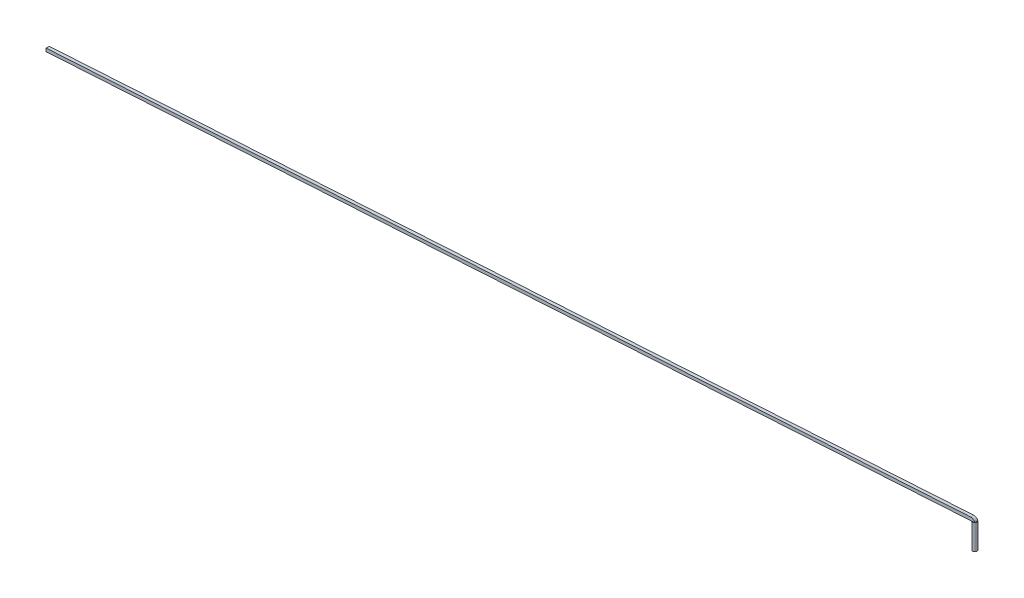
ISO-10303-21;
HEADER;
FILE_DESCRIPTION(('STEP AP214'),'2;1');
FILE_NAME('part.step','',(''),(''),'','','');
FILE_SCHEMA(('AUTOMOTIVE_DESIGN { 1 0 10303 214 1 1 1 1 }'));
ENDSEC;
DATA;
#1=APPLICATION_CONTEXT('core data for automotive mechanical design processes');
#2=APPLICATION_PROTOCOL_DEFINITION('international standard','automotive_design',2000,#1);
#3=PRODUCT_CONTEXT('',#1,'mechanical');
#4=PRODUCT('Part','Part','',(#3));
#5=PRODUCT_RELATED_PRODUCT_CATEGORY('part','',(#4));
#6=PRODUCT_DEFINITION_FORMATION('','',#4);
#7=PRODUCT_DEFINITION_CONTEXT('part definition',#1,'design');
#8=PRODUCT_DEFINITION('design','',#6,#7);
#9=PRODUCT_DEFINITION_SHAPE('','',#8);
#10=(LENGTH_UNIT() NAMED_UNIT(*) SI_UNIT(.MILLI.,.METRE.));
#11=(NAMED_UNIT(*) PLANE_ANGLE_UNIT() SI_UNIT($,.RADIAN.));
#12=(NAMED_UNIT(*) SI_UNIT($,.STERADIAN.) SOLID_ANGLE_UNIT());
#13=UNCERTAINTY_MEASURE_WITH_UNIT(LENGTH_MEASURE(1.E-05),#10,'distance_accuracy_value','');
#14=(GEOMETRIC_REPRESENTATION_CONTEXT(3) GLOBAL_UNCERTAINTY_ASSIGNED_CONTEXT((#13)) GLOBAL_UNIT_ASSIGNED_CONTEXT((#10,
#11,#12)) REPRESENTATION_CONTEXT('',''));
#15=CARTESIAN_POINT('',(0.,0.,0.));
#16=DIRECTION('',(0.,0.,1.));
#17=DIRECTION('',(1.,0.,0.));
#18=AXIS2_PLACEMENT_3D('',#15,#16,#17);
#19=CARTESIAN_POINT('',(-0.3,7.68120178719591,1.));
#20=DIRECTION('',(0.,0.,-1.));
#21=DIRECTION('',(-1.,0.,0.));
#22=AXIS2_PLACEMENT_3D('',#19,#20,#21);
#23=CYLINDRICAL_SURFACE('',#22,1.3);
#24=DIRECTION('',(0.,0.,-1.));
#25=VECTOR('',#24,1.);
#26=CARTESIAN_POINT('',(0.944368205131599,8.05743013548662,1.));
#27=LINE('',#26,#25);
#28=CARTESIAN_POINT('',(0.944368205131599,8.05743013548662,0.));
#29=VERTEX_POINT('',#28);
#30=CARTESIAN_POINT('',(0.944368205131599,8.05743013548662,1.));
#31=VERTEX_POINT('',#30);
#32=EDGE_CURVE('E104',#29,#31,#27,.F.);
#33=ORIENTED_EDGE('',*,*,#32,.F.);
#34=CARTESIAN_POINT('',(-0.3,7.68120178719591,0.));
#35=DIRECTION('',(0.,0.,1.));
#36=DIRECTION('',(1.,0.,0.));
#37=AXIS2_PLACEMENT_3D('',#34,#35,#36);
#38=CIRCLE('',#37,1.3);
#39=CARTESIAN_POINT('',(-0.378911491407106,8.97880456791268,0.));
#40=VERTEX_POINT('',#39);
#41=EDGE_CURVE('E89',#29,#40,#38,.T.);
#42=ORIENTED_EDGE('',*,*,#41,.T.);
#43=DIRECTION('',(0.,0.,-1.));
#44=VECTOR('',#43,1.);
#45=CARTESIAN_POINT('',(-0.378911491407106,8.97880456791268,1.));
#46=LINE('',#45,#44);
#47=CARTESIAN_POINT('',(-0.378911491407106,8.97880456791268,1.));
#48=VERTEX_POINT('',#47);
#49=EDGE_CURVE('E119',#48,#40,#46,.T.);
#50=ORIENTED_EDGE('',*,*,#49,.F.);
#51=CARTESIAN_POINT('',(-0.3,7.68120178719591,1.));
#52=DIRECTION('',(0.,0.,1.));
#53=DIRECTION('',(1.,0.,0.));
#54=AXIS2_PLACEMENT_3D('',#51,#52,#53);
#55=CIRCLE('',#54,1.3);
#56=EDGE_CURVE('E105',#31,#48,#55,.T.);
#57=ORIENTED_EDGE('',*,*,#56,.F.);
#58=EDGE_LOOP('',(#33,#42,#50,#57));
#59=FACE_BOUND('',#58,.T.);
#60=ADVANCED_FACE('F33',(#59),#23,.T.);
#61=CARTESIAN_POINT('',(-0.378911491407106,8.97880456791268,1.));
#62=DIRECTION('',(0.0607011472362354,-0.99815598516675,0.));
#63=DIRECTION('',(0.99815598516675,0.0607011472362354,0.));
#64=AXIS2_PLACEMENT_3D('',#61,#62,#63);
#65=PLANE('',#64);
#66=DIRECTION('',(-0.99815598516675,-0.0607011472362354,0.));
#67=VECTOR('',#66,1.);
#68=CARTESIAN_POINT('',(-0.378911491407106,8.97880456791268,0.));
#69=LINE('',#68,#67);
#70=CARTESIAN_POINT('',(-296.918177820015,-9.05472319150956,0.));
#71=VERTEX_POINT('',#70);
#72=EDGE_CURVE('E96',#40,#71,#69,.T.);
#73=ORIENTED_EDGE('',*,*,#72,.T.);
#74=DIRECTION('',(0.,0.,-1.));
#75=VECTOR('',#74,1.);
#76=CARTESIAN_POINT('',(-296.918177820015,-9.05472319150956,1.));
#77=LINE('',#76,#75);
#78=CARTESIAN_POINT('',(-296.918177820015,-9.05472319150956,1.));
#79=VERTEX_POINT('',#78);
#80=EDGE_CURVE('E112',#79,#71,#77,.T.);
#81=ORIENTED_EDGE('',*,*,#80,.F.);
#82=DIRECTION('',(-0.99815598516675,-0.0607011472362354,0.));
#83=VECTOR('',#82,1.);
#84=CARTESIAN_POINT('',(-0.378911491407106,8.97880456791268,1.));
#85=LINE('',#84,#83);
#86=EDGE_CURVE('E100',#48,#79,#85,.T.);
#87=ORIENTED_EDGE('',*,*,#86,.F.);
#88=ORIENTED_EDGE('',*,*,#49,.T.);
#89=EDGE_LOOP('',(#73,#81,#87,#88));
#90=FACE_BOUND('',#89,.T.);
#91=ADVANCED_FACE('F35',(#90),#65,.F.);
#92=CARTESIAN_POINT('',(-296.857476672778,-10.0528791766763,1.));
#93=DIRECTION('',(-0.998155985166741,-0.0607011472363859,0.));
#94=DIRECTION('',(0.0607011472363859,-0.998155985166741,0.));
#95=AXIS2_PLACEMENT_3D('',#92,#93,#94);
#96=PLANE('',#95);
#97=DIRECTION('',(-0.0607011472363859,0.998155985166741,0.));
#98=VECTOR('',#97,1.);
#99=CARTESIAN_POINT('',(-296.857476672778,-10.0528791766763,0.));
#100=LINE('',#99,#98);
#101=CARTESIAN_POINT('',(-296.857476672778,-10.0528791766763,0.));
#102=VERTEX_POINT('',#101);
#103=EDGE_CURVE('E126',#102,#71,#100,.T.);
#104=ORIENTED_EDGE('',*,*,#103,.F.);
#105=DIRECTION('',(0.,0.,-1.));
#106=VECTOR('',#105,1.);
#107=CARTESIAN_POINT('',(-296.857476672778,-10.0528791766763,1.));
#108=LINE('',#107,#106);
#109=CARTESIAN_POINT('',(-296.857476672778,-10.0528791766763,1.));
#110=VERTEX_POINT('',#109);
#111=EDGE_CURVE('E113',#110,#102,#108,.T.);
#112=ORIENTED_EDGE('',*,*,#111,.F.);
#113=DIRECTION('',(-0.0607011472363859,0.998155985166741,0.));
#114=VECTOR('',#113,1.);
#115=CARTESIAN_POINT('',(-296.857476672778,-10.0528791766763,1.));
#116=LINE('',#115,#114);
#117=EDGE_CURVE('E136',#110,#79,#116,.T.);
#118=ORIENTED_EDGE('',*,*,#117,.T.);
#119=ORIENTED_EDGE('',*,*,#80,.T.);
#120=EDGE_LOOP('',(#104,#112,#118,#119));
#121=FACE_BOUND('',#120,.T.);
#122=ADVANCED_FACE('F184',(#121),#96,.T.);
#123=CARTESIAN_POINT('',(-0.318210344170871,7.98064858274593,1.));
#124=DIRECTION('',(0.0607011472362354,-0.99815598516675,0.));
#125=DIRECTION('',(0.99815598516675,0.0607011472362354,0.));
#126=AXIS2_PLACEMENT_3D('',#123,#124,#125);
#127=PLANE('',#126);
#128=DIRECTION('',(-0.99815598516675,-0.0607011472362354,0.));
#129=VECTOR('',#128,1.);
#130=CARTESIAN_POINT('',(-0.318210344170871,7.98064858274593,0.));
#131=LINE('',#130,#129);
#132=CARTESIAN_POINT('',(-0.318210344170871,7.98064858274593,0.));
#133=VERTEX_POINT('',#132);
#134=EDGE_CURVE('E123',#133,#102,#131,.T.);
#135=ORIENTED_EDGE('',*,*,#134,.F.);
#136=DIRECTION('',(0.,0.,-1.));
#137=VECTOR('',#136,1.);
#138=CARTESIAN_POINT('',(-0.318210344170871,7.98064858274593,1.));
#139=LINE('',#138,#137);
#140=CARTESIAN_POINT('',(-0.318210344170871,7.98064858274593,1.));
#141=VERTEX_POINT('',#140);
#142=EDGE_CURVE('E117',#141,#133,#139,.T.);
#143=ORIENTED_EDGE('',*,*,#142,.F.);
#144=DIRECTION('',(-0.99815598516675,-0.0607011472362354,0.));
#145=VECTOR('',#144,1.);
#146=CARTESIAN_POINT('',(-0.318210344170871,7.98064858274593,1.));
#147=LINE('',#146,#145);
#148=EDGE_CURVE('E133',#141,#110,#147,.T.);
#149=ORIENTED_EDGE('',*,*,#148,.T.);
#150=ORIENTED_EDGE('',*,*,#111,.T.);
#151=EDGE_LOOP('',(#135,#143,#149,#150));
#152=FACE_BOUND('',#151,.T.);
#153=ADVANCED_FACE('F181',(#152),#127,.T.);
#154=CARTESIAN_POINT('',(-0.3,7.68120178719591,1.));
#155=DIRECTION('',(0.,0.,-1.));
#156=DIRECTION('',(-1.,0.,0.));
#157=AXIS2_PLACEMENT_3D('',#154,#155,#156);
#158=CYLINDRICAL_SURFACE('',#157,0.3);
#159=CARTESIAN_POINT('',(0.,7.68120178719591,1.));
#160=CARTESIAN_POINT('',(-7.26173648556424E-07,7.69385799721793,0.999999705916547));
#161=CARTESIAN_POINT('',(-0.000807102196805886,7.70652225965943,0.999196895823394));
#162=CARTESIAN_POINT('',(-0.00397150195700255,7.73145571898704,0.996001557009433));
#163=CARTESIAN_POINT('',(-0.00633102568878902,7.74372452191988,0.993607491468467));
#164=CARTESIAN_POINT('',(-0.0124086622816113,7.76746228751116,0.987294873516328));
#165=CARTESIAN_POINT('',(-0.0161225035460254,7.7789336314183,0.983381111827978));
#166=CARTESIAN_POINT('',(-0.0246372029797585,7.80084127083491,0.974125668088126));
#167=CARTESIAN_POINT('',(-0.0294380174065998,7.81127760797131,0.968784043495782));
#168=CARTESIAN_POINT('',(-0.0399682136960889,7.83125161151331,0.95661876203909));
#169=CARTESIAN_POINT('',(-0.0457217263502536,7.84075149069014,0.949754370643423));
#170=CARTESIAN_POINT('',(-0.0576938506164021,7.85840705545156,0.934821270509499));
#171=CARTESIAN_POINT('',(-0.0639126494107489,7.86656219578122,0.926752075770874));
#172=CARTESIAN_POINT('',(-0.0797156268335237,7.88539240945124,0.905198878194086));
#173=CARTESIAN_POINT('',(-0.0893977343312239,7.89522973424753,0.891052977001354));
#174=CARTESIAN_POINT('',(-0.108284597659069,7.91230359301541,0.860982291590922));
#175=CARTESIAN_POINT('',(-0.117488106711858,7.91953359939516,0.845053171701833));
#176=CARTESIAN_POINT('',(-0.138799817601489,7.93468929403512,0.804415430681646));
#177=CARTESIAN_POINT('',(-0.150347793431471,7.94146004498982,0.778985431062978));
#178=CARTESIAN_POINT('',(-0.170476542537307,7.95203763137276,0.726408572118682));
#179=CARTESIAN_POINT('',(-0.179051821895036,7.95583899507129,0.699258642472893));
#180=CARTESIAN_POINT('',(-0.194885163598573,7.96235345622134,0.63594813635039));
#181=CARTESIAN_POINT('',(-0.201049966440456,7.96443645334631,0.599447209769539));
#182=CARTESIAN_POINT('',(-0.207601150173896,7.96663715093058,0.525860560460532));
#183=CARTESIAN_POINT('',(-0.207982196813859,7.96675303717146,0.488774329462459));
#184=CARTESIAN_POINT('',(-0.202941614518629,7.96508024989789,0.414819989148297));
#185=CARTESIAN_POINT('',(-0.197485876236953,7.96328038129795,0.377954441968096));
#186=CARTESIAN_POINT('',(-0.180914891546023,7.95670168200588,0.3057998181373));
#187=CARTESIAN_POINT('',(-0.169811995293128,7.9519293469104,0.270507483343711));
#188=CARTESIAN_POINT('',(-0.148217958556991,7.94013016635716,0.21665021276114));
#189=CARTESIAN_POINT('',(-0.139289259689327,7.93479117874104,0.197084045811171));
#190=CARTESIAN_POINT('',(-0.120096510977168,7.92155768202548,0.159528439443205));
#191=CARTESIAN_POINT('',(-0.109834896468921,7.91366779538875,0.141536222252945));
#192=CARTESIAN_POINT('',(-0.0911947934647511,7.89688131955956,0.111771703428119));
#193=CARTESIAN_POINT('',(-0.0829466810169931,7.88866695124931,0.0995361130986284));
#194=CARTESIAN_POINT('',(-0.0665912201899857,7.87007473673114,0.0767147645941639));
#195=CARTESIAN_POINT('',(-0.0584837035005057,7.85969970331427,0.0661268923972367));
#196=CARTESIAN_POINT('',(-0.044512040112518,7.8388488706642,0.0487712728546217));
#197=CARTESIAN_POINT('',(-0.0385114365050626,7.82875239498107,0.0416593313774167));
#198=CARTESIAN_POINT('',(-0.0274539703355095,7.80715996095707,0.0289765033182947));
#199=CARTESIAN_POINT('',(-0.0223968158405776,7.79566443735098,0.0234051397749312));
#200=CARTESIAN_POINT('',(-0.0136018507364794,7.77144013802301,0.0139387591575539));
#201=CARTESIAN_POINT('',(-0.00987180728164916,7.75870464020334,0.0100535826196241));
#202=CARTESIAN_POINT('',(-0.0041036080716604,7.73244359016248,0.00411993141476095));
#203=CARTESIAN_POINT('',(-0.00206485218179436,7.71891832000833,0.00207080522495451));
#204=CARTESIAN_POINT('',(2.23021064900403E-05,7.69297060912929,-2.4104829687626E-05));
#205=CARTESIAN_POINT('',(0.000253209396956618,7.68057714008174,-0.000253619005369094));
#206=CARTESIAN_POINT('',(-0.000812531919767959,7.65592519349042,0.000813254345156136));
#207=CARTESIAN_POINT('',(-0.00210869552537703,7.64366667433404,0.00210915739487546));
#208=CARTESIAN_POINT('',(-0.00606708457093994,7.62002404101484,0.0061340086665078));
#209=CARTESIAN_POINT('',(-0.00868534509278512,7.60862457218096,0.00881689854651631));
#210=CARTESIAN_POINT('',(-0.0150825210927869,7.58657694485022,0.0155298040050478));
#211=CARTESIAN_POINT('',(-0.0188614829636466,7.57592881640501,0.0195598734302913));
#212=CARTESIAN_POINT('',(-0.0275395826636874,7.55511248906777,0.0291016623872475));
#213=CARTESIAN_POINT('',(-0.0324835328517568,7.54499136748641,0.0346748555675623));
#214=CARTESIAN_POINT('',(-0.0430638578654944,7.525951298929,0.0470671139094722));
#215=CARTESIAN_POINT('',(-0.048700557005645,7.51703291915268,0.0538867633402921));
#216=CARTESIAN_POINT('',(-0.0627291323093269,7.49706613499851,0.071620359739372));
#217=CARTESIAN_POINT('',(-0.0713094067317054,7.48662601802274,0.0830716171835559));
#218=CARTESIAN_POINT('',(-0.088496471974667,7.46806547864449,0.107700151827451));
#219=CARTESIAN_POINT('',(-0.0971032817585946,7.45994965835419,0.120880779004029));
#220=CARTESIAN_POINT('',(-0.117293942443021,7.44274512862971,0.154355054109984));
#221=CARTESIAN_POINT('',(-0.128619536760451,7.43466618645359,0.175320043271504));
#222=CARTESIAN_POINT('',(-0.149351038348243,7.42147949971963,0.219047037934616));
#223=CARTESIAN_POINT('',(-0.158752735568836,7.4163782269577,0.241812836438434));
#224=CARTESIAN_POINT('',(-0.178448243908797,7.40662631676812,0.297766265786072));
#225=CARTESIAN_POINT('',(-0.187626179597179,7.40295053917623,0.331516911555811));
#226=CARTESIAN_POINT('',(-0.200898962614443,7.39795647941034,0.400158773146987));
#227=CARTESIAN_POINT('',(-0.204989480380982,7.39664020483235,0.435050934558056));
#228=CARTESIAN_POINT('',(-0.207980893146365,7.39565818251137,0.50566120035043));
#229=CARTESIAN_POINT('',(-0.206794423180009,7.39602022487305,0.541383394869507));
#230=CARTESIAN_POINT('',(-0.199057408423162,7.39866291843729,0.612176463593764));
#231=CARTESIAN_POINT('',(-0.192509336276552,7.40094268524401,0.647247630414397));
#232=CARTESIAN_POINT('',(-0.176393820682041,7.40774598163419,0.707952413464871));
#233=CARTESIAN_POINT('',(-0.167843351478369,7.41164589896428,0.733927463490316));
#234=CARTESIAN_POINT('',(-0.148033109372189,7.42229404217345,0.784212637139447));
#235=CARTESIAN_POINT('',(-0.136778845412953,7.42903649724035,0.808526018642488));
#236=CARTESIAN_POINT('',(-0.116212736401476,7.44386844712718,0.847277245612552));
#237=CARTESIAN_POINT('',(-0.107412989893083,7.45085672889591,0.862405694380858));
#238=CARTESIAN_POINT('',(-0.0893844803244646,7.46721845027299,0.891036952379667));
#239=CARTESIAN_POINT('',(-0.0801564391575506,7.47658798763006,0.904542368508614));
#240=CARTESIAN_POINT('',(-0.0638913042849661,7.49579458253079,0.926820744185215));
#241=CARTESIAN_POINT('',(-0.056800720389197,7.50512117382505,0.935992124435186));
#242=CARTESIAN_POINT('',(-0.0432613016372748,7.52552643859791,0.9527505535723));
#243=CARTESIAN_POINT('',(-0.036812431391785,7.53660501537038,0.960337689852982));
#244=CARTESIAN_POINT('',(-0.0250314047142583,7.56049127594624,0.973732801293645));
#245=CARTESIAN_POINT('',(-0.0197096634927293,7.57331342851491,0.979524394348659));
#246=CARTESIAN_POINT('',(-0.010781550948069,7.6002522598848,0.989024961122222));
#247=CARTESIAN_POINT('',(-0.0071718215529472,7.61436633914727,0.992738014451332));
#248=CARTESIAN_POINT('',(-0.00308724933456719,7.63739765561492,0.996897944330913));
#249=CARTESIAN_POINT('',(-0.00193397642581683,7.64607583290028,0.998059690627297));
#250=CARTESIAN_POINT('',(-0.000390127142715643,7.66356863952005,0.999610792182199));
#251=CARTESIAN_POINT('',(5.05979517488607E-07,7.67238325865264,1.00000020490995));
#252=CARTESIAN_POINT('',(0.,7.68120178719591,1.));
#253=B_SPLINE_CURVE_WITH_KNOTS('',3,(#159,#160,#161,#162,#163,#164,#165,#166,#167,#168,#169,
#170,#171,#172,#173,#174,#175,#176,#177,#178,#179,#180,#181,#182,#183,#184,#185,#186,#187,#188,
#189,#190,#191,#192,#193,#194,#195,#196,#197,#198,#199,#200,#201,#202,#203,#204,#205,#206,#207,
#208,#209,#210,#211,#212,#213,#214,#215,#216,#217,#218,#219,#220,#221,#222,#223,#224,#225,#226,
#227,#228,#229,#230,#231,#232,#233,#234,#235,#236,#237,#238,#239,#240,#241,#242,#243,#244,#245,
#246,#247,#248,#249,#250,#251,#252),.UNSPECIFIED.,.T.,.F.,(4,2,2,2,2,2,2,2,2,2,2,2,2,2,2,2,2,2,
2,2,2,2,2,2,2,2,2,2,2,2,2,2,2,2,2,2,2,2,2,2,2,2,2,2,2,2,4),(0.,0.0379326032328532,
0.0759018947675618,0.11375245033683,0.15160148297714,0.190621364268364,0.229657028358,
0.288612740844154,0.347715044582384,0.433453197040996,0.519348970065742,0.630018853480514,
0.740790799490695,0.85221363512771,0.96339383364003,1.02969155174174,1.09586979939294,
1.14635731548367,1.19677951237073,1.23780224081735,1.27881225441028,1.32005848417236,
1.3612900718976,1.39829760002815,1.43529337764191,1.47113278919105,1.50697363341157,
1.54452305751785,1.58209012805298,1.63493150823766,1.68787680233027,1.7629387059067,
1.83816315059593,1.94311690772453,2.04815992301808,2.15494842844613,2.26168771326555,
2.34430129558319,2.4267479605137,2.48310806727449,2.53937640356844,2.58384001919078,
2.62830118136532,2.67315680729001,2.71792408228602,2.74435653223392,2.77078701527326),.UNSPECIFIED.);
#254=CARTESIAN_POINT('',(0.,7.68120178719591,1.));
#255=VERTEX_POINT('',#254);
#256=CARTESIAN_POINT('',(0.,7.68120178719591,0.));
#257=VERTEX_POINT('',#256);
#258=EDGE_CURVE('E141',#255,#257,#253,.T.);
#259=ORIENTED_EDGE('',*,*,#258,.F.);
#260=CARTESIAN_POINT('',(-0.3,7.68120178719591,1.));
#261=DIRECTION('',(0.,0.,1.));
#262=DIRECTION('',(1.,0.,0.));
#263=AXIS2_PLACEMENT_3D('',#260,#261,#262);
#264=CIRCLE('',#263,0.3);
#265=EDGE_CURVE('E130',#255,#141,#264,.T.);
#266=ORIENTED_EDGE('',*,*,#265,.T.);
#267=ORIENTED_EDGE('',*,*,#142,.T.);
#268=CARTESIAN_POINT('',(-0.3,7.68120178719591,0.));
#269=DIRECTION('',(0.,0.,1.));
#270=DIRECTION('',(1.,0.,0.));
#271=AXIS2_PLACEMENT_3D('',#268,#269,#270);
#272=CIRCLE('',#271,0.3);
#273=EDGE_CURVE('E101',#257,#133,#272,.T.);
#274=ORIENTED_EDGE('',*,*,#273,.F.);
#275=EDGE_LOOP('',(#259,#266,#267,#274));
#276=FACE_BOUND('',#275,.T.);
#277=ADVANCED_FACE('F148',(#276),#158,.F.);
#278=CARTESIAN_POINT('',(-0.3,7.68120178719591,1.));
#279=DIRECTION('',(0.,0.,1.));
#280=DIRECTION('',(1.,0.,0.));
#281=AXIS2_PLACEMENT_3D('',#278,#279,#280);
#282=PLANE('',#281);
#283=DIRECTION('',(0.,-1.,0.));
#284=VECTOR('',#283,1.);
#285=CARTESIAN_POINT('',(0.,10.0322540654264,1.));
#286=LINE('',#285,#284);
#287=CARTESIAN_POINT('',(0.,8.,1.));
#288=VERTEX_POINT('',#287);
#289=EDGE_CURVE('E48',#288,#255,#286,.T.);
#290=ORIENTED_EDGE('',*,*,#289,.F.);
#291=DIRECTION('',(0.99815598516675,0.0607011472362354,0.));
#292=VECTOR('',#291,1.);
#293=CARTESIAN_POINT('',(-0.318210344170871,7.98064858274593,1.));
#294=LINE('',#293,#292);
#295=EDGE_CURVE('E52',#288,#31,#294,.T.);
#296=ORIENTED_EDGE('',*,*,#295,.T.);
#297=ORIENTED_EDGE('',*,*,#56,.T.);
#298=ORIENTED_EDGE('',*,*,#86,.T.);
#299=ORIENTED_EDGE('',*,*,#117,.F.);
#300=ORIENTED_EDGE('',*,*,#148,.F.);
#301=ORIENTED_EDGE('',*,*,#265,.F.);
#302=EDGE_LOOP('',(#290,#296,#297,#298,#299,#300,#301));
#303=FACE_BOUND('',#302,.T.);
#304=ADVANCED_FACE('F158',(#303),#282,.T.);
#305=CARTESIAN_POINT('',(-0.3,7.68120178719591,0.));
#306=DIRECTION('',(0.,0.,1.));
#307=DIRECTION('',(1.,0.,0.));
#308=AXIS2_PLACEMENT_3D('',#305,#306,#307);
#309=PLANE('',#308);
#310=DIRECTION('',(0.99815598516675,0.0607011472362354,0.));
#311=VECTOR('',#310,1.);
#312=CARTESIAN_POINT('',(-0.318210344170871,7.98064858274593,0.));
#313=LINE('',#312,#311);
#314=CARTESIAN_POINT('',(0.,8.,0.));
#315=VERTEX_POINT('',#314);
#316=EDGE_CURVE('E41',#315,#29,#313,.T.);
#317=ORIENTED_EDGE('',*,*,#316,.F.);
#318=DIRECTION('',(0.,-1.,0.));
#319=VECTOR('',#318,1.);
#320=CARTESIAN_POINT('',(0.,10.0322540654264,0.));
#321=LINE('',#320,#319);
#322=EDGE_CURVE('E11',#315,#257,#321,.T.);
#323=ORIENTED_EDGE('',*,*,#322,.T.);
#324=ORIENTED_EDGE('',*,*,#273,.T.);
#325=ORIENTED_EDGE('',*,*,#134,.T.);
#326=ORIENTED_EDGE('',*,*,#103,.T.);
#327=ORIENTED_EDGE('',*,*,#72,.F.);
#328=ORIENTED_EDGE('',*,*,#41,.F.);
#329=EDGE_LOOP('',(#317,#323,#324,#325,#326,#327,#328));
#330=FACE_BOUND('',#329,.T.);
#331=ADVANCED_FACE('F91',(#330),#309,.F.);
#332=CARTESIAN_POINT('',(0.5,10.0322540654264,0.5));
#333=DIRECTION('',(0.,-1.,0.));
#334=DIRECTION('',(0.,0.,-1.));
#335=AXIS2_PLACEMENT_3D('',#332,#333,#334);
#336=CYLINDRICAL_SURFACE('',#335,0.707106781186547);
#337=CARTESIAN_POINT('',(0.5,0.,0.5));
#338=DIRECTION('',(0.,-1.,0.));
#339=DIRECTION('',(0.,0.,-1.));
#340=AXIS2_PLACEMENT_3D('',#337,#338,#339);
#341=CIRCLE('',#340,0.707106781186547);
#342=CARTESIAN_POINT('',(0.5,0.,-0.207106781186547));
#343=VERTEX_POINT('',#342);
#344=EDGE_CURVE('E172',#343,#343,#341,.T.);
#345=ORIENTED_EDGE('',*,*,#344,.F.);
#346=EDGE_LOOP('',(#345));
#347=FACE_BOUND('',#346,.T.);
#348=ORIENTED_EDGE('',*,*,#289,.T.);
#349=ORIENTED_EDGE('',*,*,#258,.T.);
#350=ORIENTED_EDGE('',*,*,#322,.F.);
#351=CARTESIAN_POINT('',(0.5,8.03040664392054,0.5));
#352=DIRECTION('',(0.0607011472362354,-0.99815598516675,0.));
#353=DIRECTION('',(-0.99815598516675,-0.0607011472362354,0.));
#354=AXIS2_PLACEMENT_3D('',#351,#352,#353);
#355=ELLIPSE('',#354,0.708413105461087,0.707106781186547);
#356=EDGE_CURVE('E107',#288,#315,#355,.F.);
#357=ORIENTED_EDGE('',*,*,#356,.F.);
#358=EDGE_LOOP('',(#348,#349,#350,#357));
#359=FACE_BOUND('',#358,.T.);
#360=ADVANCED_FACE('F152',(#347,#359),#336,.T.);
#361=CARTESIAN_POINT('',(-0.318210344170871,7.98064858274593,1.));
#362=DIRECTION('',(0.0607011472362354,-0.99815598516675,0.));
#363=DIRECTION('',(0.99815598516675,0.0607011472362354,0.));
#364=AXIS2_PLACEMENT_3D('',#361,#362,#363);
#365=PLANE('',#364);
#366=ORIENTED_EDGE('',*,*,#295,.F.);
#367=ORIENTED_EDGE('',*,*,#356,.T.);
#368=ORIENTED_EDGE('',*,*,#316,.T.);
#369=ORIENTED_EDGE('',*,*,#32,.T.);
#370=EDGE_LOOP('',(#366,#367,#368,#369));
#371=FACE_BOUND('',#370,.T.);
#372=ADVANCED_FACE('F110',(#371),#365,.F.);
#373=CARTESIAN_POINT('',(1.,0.,1.));
#374=DIRECTION('',(0.,-1.,0.));
#375=DIRECTION('',(0.,0.,-1.));
#376=AXIS2_PLACEMENT_3D('',#373,#374,#375);
#377=PLANE('',#376);
#378=ORIENTED_EDGE('',*,*,#344,.T.);
#379=EDGE_LOOP('',(#378));
#380=FACE_BOUND('',#379,.T.);
#381=ADVANCED_FACE('F164',(#380),#377,.T.);
#382=CLOSED_SHELL('',(#60,#91,#122,#153,#277,#304,#331,#360,#372,#381));
#383=MANIFOLD_SOLID_BREP('B2',#382);
#384=ADVANCED_BREP_SHAPE_REPRESENTATION('',(#18,#383),#14);
#385=SHAPE_DEFINITION_REPRESENTATION(#9,#384);
ENDSEC;
END-ISO-10303-21;
